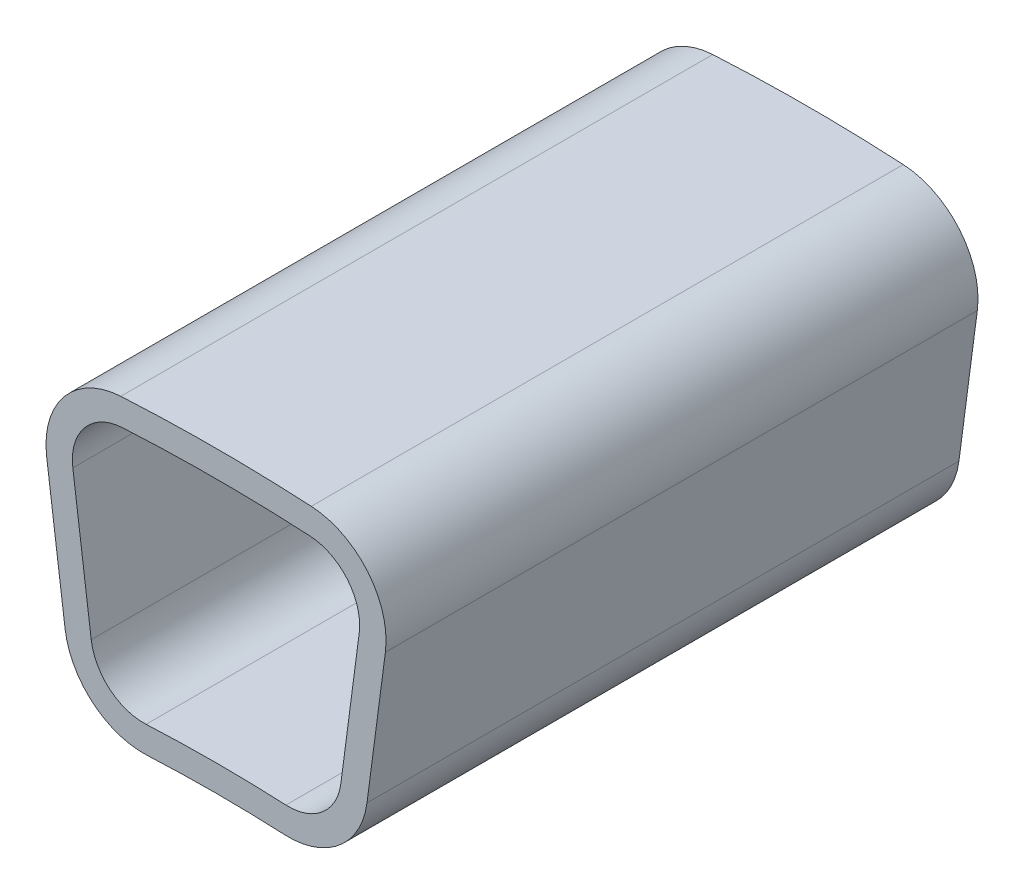
ISO-10303-21;
HEADER;
FILE_DESCRIPTION(('STEP AP214'),'2;1');
FILE_NAME('part.step','',(''),(''),'','','');
FILE_SCHEMA(('AUTOMOTIVE_DESIGN { 1 0 10303 214 1 1 1 1 }'));
ENDSEC;
DATA;
#1=APPLICATION_CONTEXT('core data for automotive mechanical design processes');
#2=APPLICATION_PROTOCOL_DEFINITION('international standard','automotive_design',2000,#1);
#3=PRODUCT_CONTEXT('',#1,'mechanical');
#4=PRODUCT('Part','Part','',(#3));
#5=PRODUCT_RELATED_PRODUCT_CATEGORY('part','',(#4));
#6=PRODUCT_DEFINITION_FORMATION('','',#4);
#7=PRODUCT_DEFINITION_CONTEXT('part definition',#1,'design');
#8=PRODUCT_DEFINITION('design','',#6,#7);
#9=PRODUCT_DEFINITION_SHAPE('','',#8);
#10=(LENGTH_UNIT() NAMED_UNIT(*) SI_UNIT(.MILLI.,.METRE.));
#11=(NAMED_UNIT(*) PLANE_ANGLE_UNIT() SI_UNIT($,.RADIAN.));
#12=(NAMED_UNIT(*) SI_UNIT($,.STERADIAN.) SOLID_ANGLE_UNIT());
#13=UNCERTAINTY_MEASURE_WITH_UNIT(LENGTH_MEASURE(1.E-05),#10,'distance_accuracy_value','');
#14=(GEOMETRIC_REPRESENTATION_CONTEXT(3) GLOBAL_UNCERTAINTY_ASSIGNED_CONTEXT((#13)) GLOBAL_UNIT_ASSIGNED_CONTEXT((#10,
#11,#12)) REPRESENTATION_CONTEXT('',''));
#15=CARTESIAN_POINT('',(0.,0.,0.));
#16=DIRECTION('',(0.,0.,1.));
#17=DIRECTION('',(1.,0.,0.));
#18=AXIS2_PLACEMENT_3D('',#15,#16,#17);
#19=CARTESIAN_POINT('',(0.,0.,59.4458118903769));
#20=DIRECTION('',(0.,0.,-1.));
#21=DIRECTION('',(-1.,0.,0.));
#22=AXIS2_PLACEMENT_3D('',#19,#20,#21);
#23=CYLINDRICAL_SURFACE('',#22,80.5256144787589);
#24=CARTESIAN_POINT('',(0.,0.,33.65));
#25=DIRECTION('',(0.,0.,1.));
#26=DIRECTION('',(1.,0.,0.));
#27=AXIS2_PLACEMENT_3D('',#24,#25,#26);
#28=CIRCLE('',#27,80.5256144787589);
#29=CARTESIAN_POINT('',(-3.90221400091127,80.4310096484733,33.65));
#30=VERTEX_POINT('',#29);
#31=CARTESIAN_POINT('',(3.90221400091125,80.4310096484733,33.65));
#32=VERTEX_POINT('',#31);
#33=EDGE_CURVE('E314',#30,#32,#28,.F.);
#34=ORIENTED_EDGE('',*,*,#33,.F.);
#35=DIRECTION('',(0.,0.,-1.));
#36=VECTOR('',#35,1.);
#37=CARTESIAN_POINT('',(-3.90221400091127,80.4310096484733,59.4458118903769));
#38=LINE('',#37,#36);
#39=CARTESIAN_POINT('',(-3.90221400091127,80.4310096484733,0.));
#40=VERTEX_POINT('',#39);
#41=EDGE_CURVE('E58',#30,#40,#38,.T.);
#42=ORIENTED_EDGE('',*,*,#41,.T.);
#43=CARTESIAN_POINT('',(0.,0.,0.));
#44=DIRECTION('',(0.,0.,-1.));
#45=DIRECTION('',(1.,0.,0.));
#46=AXIS2_PLACEMENT_3D('',#43,#44,#45);
#47=CIRCLE('',#46,80.5256144787589);
#48=CARTESIAN_POINT('',(3.90221400091125,80.4310096484733,0.));
#49=VERTEX_POINT('',#48);
#50=EDGE_CURVE('E209',#40,#49,#47,.T.);
#51=ORIENTED_EDGE('',*,*,#50,.T.);
#52=DIRECTION('',(0.,0.,-1.));
#53=VECTOR('',#52,1.);
#54=CARTESIAN_POINT('',(3.90221400091125,80.4310096484733,59.4458118903769));
#55=LINE('',#54,#53);
#56=EDGE_CURVE('E212',#32,#49,#55,.T.);
#57=ORIENTED_EDGE('',*,*,#56,.F.);
#58=EDGE_LOOP('',(#34,#42,#51,#57));
#59=FACE_BOUND('',#58,.T.);
#60=ADVANCED_FACE('F43',(#59),#23,.F.);
#61=CARTESIAN_POINT('',(-4.12028080012497,84.9257228619143,59.4458118903769));
#62=DIRECTION('',(0.,0.,-1.));
#63=DIRECTION('',(-1.,0.,0.));
#64=AXIS2_PLACEMENT_3D('',#61,#62,#63);
#65=CYLINDRICAL_SURFACE('',#64,4.5);
#66=CARTESIAN_POINT('',(-4.12028080012497,84.9257228619143,33.65));
#67=DIRECTION('',(0.,0.,1.));
#68=DIRECTION('',(1.,0.,0.));
#69=AXIS2_PLACEMENT_3D('',#66,#67,#68);
#70=CIRCLE('',#69,4.5);
#71=CARTESIAN_POINT('',(-8.58178267630712,84.338354996924,33.65));
#72=VERTEX_POINT('',#71);
#73=EDGE_CURVE('E250',#72,#30,#70,.T.);
#74=ORIENTED_EDGE('',*,*,#73,.F.);
#75=DIRECTION('',(0.,0.,-1.));
#76=VECTOR('',#75,1.);
#77=CARTESIAN_POINT('',(-8.58178267630712,84.338354996924,59.4458118903769));
#78=LINE('',#77,#76);
#79=CARTESIAN_POINT('',(-8.58178267630712,84.338354996924,0.));
#80=VERTEX_POINT('',#79);
#81=EDGE_CURVE('E215',#72,#80,#78,.T.);
#82=ORIENTED_EDGE('',*,*,#81,.T.);
#83=CARTESIAN_POINT('',(-4.12028080012497,84.9257228619143,0.));
#84=DIRECTION('',(0.,0.,1.));
#85=DIRECTION('',(1.,0.,0.));
#86=AXIS2_PLACEMENT_3D('',#83,#84,#85);
#87=CIRCLE('',#86,4.5);
#88=EDGE_CURVE('E207',#80,#40,#87,.T.);
#89=ORIENTED_EDGE('',*,*,#88,.T.);
#90=ORIENTED_EDGE('',*,*,#41,.F.);
#91=EDGE_LOOP('',(#74,#82,#89,#90));
#92=FACE_BOUND('',#91,.T.);
#93=ADVANCED_FACE('F247',(#92),#65,.T.);
#94=CARTESIAN_POINT('',(-9.62675062646801,92.2756746020247,59.4458118903769));
#95=DIRECTION('',(0.99144486137381,0.13052619222005,0.));
#96=DIRECTION('',(-0.13052619222005,0.991444861373811,0.));
#97=AXIS2_PLACEMENT_3D('',#94,#95,#96);
#98=PLANE('',#97);
#99=DIRECTION('',(0.13052619222005,-0.991444861373811,0.));
#100=VECTOR('',#99,1.);
#101=CARTESIAN_POINT('',(-9.62675062646801,92.2756746020247,33.65));
#102=LINE('',#101,#100);
#103=CARTESIAN_POINT('',(-9.62675062646801,92.2756746020247,33.65));
#104=VERTEX_POINT('',#103);
#105=EDGE_CURVE('E255',#104,#72,#102,.T.);
#106=ORIENTED_EDGE('',*,*,#105,.F.);
#107=DIRECTION('',(0.,0.,-1.));
#108=VECTOR('',#107,1.);
#109=CARTESIAN_POINT('',(-9.62675062646801,92.2756746020247,59.4458118903769));
#110=LINE('',#109,#108);
#111=CARTESIAN_POINT('',(-9.62675062646801,92.2756746020247,0.));
#112=VERTEX_POINT('',#111);
#113=EDGE_CURVE('E217',#104,#112,#110,.T.);
#114=ORIENTED_EDGE('',*,*,#113,.T.);
#115=DIRECTION('',(0.13052619222005,-0.991444861373811,0.));
#116=VECTOR('',#115,1.);
#117=CARTESIAN_POINT('',(-9.62675062646801,92.2756746020247,0.));
#118=LINE('',#117,#116);
#119=EDGE_CURVE('E204',#112,#80,#118,.T.);
#120=ORIENTED_EDGE('',*,*,#119,.T.);
#121=ORIENTED_EDGE('',*,*,#81,.F.);
#122=EDGE_LOOP('',(#106,#114,#120,#121));
#123=FACE_BOUND('',#122,.T.);
#124=ADVANCED_FACE('F253',(#123),#98,.F.);
#125=CARTESIAN_POINT('',(-5.16524875028588,92.8630424670149,59.4458118903769));
#126=DIRECTION('',(0.,0.,-1.));
#127=DIRECTION('',(-1.,0.,0.));
#128=AXIS2_PLACEMENT_3D('',#125,#126,#127);
#129=CYLINDRICAL_SURFACE('',#128,4.49999999999999);
#130=CARTESIAN_POINT('',(-5.16524875028588,92.8630424670149,33.65));
#131=DIRECTION('',(0.,0.,1.));
#132=DIRECTION('',(1.,0.,0.));
#133=AXIS2_PLACEMENT_3D('',#130,#131,#132);
#134=CIRCLE('',#133,4.49999999999999);
#135=CARTESIAN_POINT('',(-5.41516245174076,97.3560974568659,33.65));
#136=VERTEX_POINT('',#135);
#137=EDGE_CURVE('E318',#136,#104,#134,.T.);
#138=ORIENTED_EDGE('',*,*,#137,.F.);
#139=DIRECTION('',(0.,0.,-1.));
#140=VECTOR('',#139,1.);
#141=CARTESIAN_POINT('',(-5.41516245174076,97.3560974568659,59.4458118903769));
#142=LINE('',#141,#140);
#143=CARTESIAN_POINT('',(-5.41516245174076,97.3560974568659,0.));
#144=VERTEX_POINT('',#143);
#145=EDGE_CURVE('E219',#136,#144,#142,.T.);
#146=ORIENTED_EDGE('',*,*,#145,.T.);
#147=CARTESIAN_POINT('',(-5.16524875028588,92.8630424670149,0.));
#148=DIRECTION('',(0.,0.,1.));
#149=DIRECTION('',(1.,0.,0.));
#150=AXIS2_PLACEMENT_3D('',#147,#148,#149);
#151=CIRCLE('',#150,4.49999999999999);
#152=EDGE_CURVE('E201',#144,#112,#151,.T.);
#153=ORIENTED_EDGE('',*,*,#152,.T.);
#154=ORIENTED_EDGE('',*,*,#113,.F.);
#155=EDGE_LOOP('',(#138,#146,#153,#154));
#156=FACE_BOUND('',#155,.T.);
#157=ADVANCED_FACE('F258',(#156),#129,.T.);
#158=CARTESIAN_POINT('',(0.,0.,59.4458118903769));
#159=DIRECTION('',(0.,0.,-1.));
#160=DIRECTION('',(-1.,0.,0.));
#161=AXIS2_PLACEMENT_3D('',#158,#159,#160);
#162=CYLINDRICAL_SURFACE('',#161,97.5065828362861);
#163=CARTESIAN_POINT('',(0.,0.,33.65));
#164=DIRECTION('',(0.,0.,1.));
#165=DIRECTION('',(1.,0.,0.));
#166=AXIS2_PLACEMENT_3D('',#163,#164,#165);
#167=CIRCLE('',#166,97.5065828362861);
#168=CARTESIAN_POINT('',(5.41516245174078,97.3560974568659,33.65));
#169=VERTEX_POINT('',#168);
#170=EDGE_CURVE('E264',#169,#136,#167,.T.);
#171=ORIENTED_EDGE('',*,*,#170,.F.);
#172=DIRECTION('',(0.,0.,-1.));
#173=VECTOR('',#172,1.);
#174=CARTESIAN_POINT('',(5.41516245174078,97.3560974568659,59.4458118903769));
#175=LINE('',#174,#173);
#176=CARTESIAN_POINT('',(5.41516245174078,97.3560974568659,0.));
#177=VERTEX_POINT('',#176);
#178=EDGE_CURVE('E221',#169,#177,#175,.T.);
#179=ORIENTED_EDGE('',*,*,#178,.T.);
#180=CARTESIAN_POINT('',(0.,0.,0.));
#181=DIRECTION('',(0.,0.,1.));
#182=DIRECTION('',(1.,0.,0.));
#183=AXIS2_PLACEMENT_3D('',#180,#181,#182);
#184=CIRCLE('',#183,97.5065828362861);
#185=EDGE_CURVE('E198',#177,#144,#184,.T.);
#186=ORIENTED_EDGE('',*,*,#185,.T.);
#187=ORIENTED_EDGE('',*,*,#145,.F.);
#188=EDGE_LOOP('',(#171,#179,#186,#187));
#189=FACE_BOUND('',#188,.T.);
#190=ADVANCED_FACE('F261',(#189),#162,.T.);
#191=CARTESIAN_POINT('',(5.16524875028588,92.8630424670149,59.4458118903769));
#192=DIRECTION('',(0.,0.,-1.));
#193=DIRECTION('',(-1.,0.,0.));
#194=AXIS2_PLACEMENT_3D('',#191,#192,#193);
#195=CYLINDRICAL_SURFACE('',#194,4.50000000000001);
#196=CARTESIAN_POINT('',(5.16524875028588,92.8630424670149,33.65));
#197=DIRECTION('',(0.,0.,1.));
#198=DIRECTION('',(1.,0.,0.));
#199=AXIS2_PLACEMENT_3D('',#196,#197,#198);
#200=CIRCLE('',#199,4.50000000000001);
#201=CARTESIAN_POINT('',(9.62675062646804,92.2756746020247,33.65));
#202=VERTEX_POINT('',#201);
#203=EDGE_CURVE('E268',#202,#169,#200,.T.);
#204=ORIENTED_EDGE('',*,*,#203,.F.);
#205=DIRECTION('',(0.,0.,-1.));
#206=VECTOR('',#205,1.);
#207=CARTESIAN_POINT('',(9.62675062646804,92.2756746020247,59.4458118903769));
#208=LINE('',#207,#206);
#209=CARTESIAN_POINT('',(9.62675062646804,92.2756746020247,0.));
#210=VERTEX_POINT('',#209);
#211=EDGE_CURVE('E223',#202,#210,#208,.T.);
#212=ORIENTED_EDGE('',*,*,#211,.T.);
#213=CARTESIAN_POINT('',(5.16524875028588,92.8630424670149,0.));
#214=DIRECTION('',(0.,0.,1.));
#215=DIRECTION('',(1.,0.,0.));
#216=AXIS2_PLACEMENT_3D('',#213,#214,#215);
#217=CIRCLE('',#216,4.50000000000001);
#218=EDGE_CURVE('E195',#210,#177,#217,.T.);
#219=ORIENTED_EDGE('',*,*,#218,.T.);
#220=ORIENTED_EDGE('',*,*,#178,.F.);
#221=EDGE_LOOP('',(#204,#212,#219,#220));
#222=FACE_BOUND('',#221,.T.);
#223=ADVANCED_FACE('F267',(#222),#195,.T.);
#224=CARTESIAN_POINT('',(8.5817826763071,84.338354996924,59.4458118903769));
#225=DIRECTION('',(-0.99144486137381,0.130526192220055,0.));
#226=DIRECTION('',(-0.130526192220055,-0.99144486137381,0.));
#227=AXIS2_PLACEMENT_3D('',#224,#225,#226);
#228=PLANE('',#227);
#229=DIRECTION('',(0.130526192220055,0.99144486137381,0.));
#230=VECTOR('',#229,1.);
#231=CARTESIAN_POINT('',(8.5817826763071,84.338354996924,33.65));
#232=LINE('',#231,#230);
#233=CARTESIAN_POINT('',(8.5817826763071,84.338354996924,33.65));
#234=VERTEX_POINT('',#233);
#235=EDGE_CURVE('E231',#234,#202,#232,.T.);
#236=ORIENTED_EDGE('',*,*,#235,.F.);
#237=DIRECTION('',(0.,0.,-1.));
#238=VECTOR('',#237,1.);
#239=CARTESIAN_POINT('',(8.5817826763071,84.338354996924,59.4458118903769));
#240=LINE('',#239,#238);
#241=CARTESIAN_POINT('',(8.5817826763071,84.338354996924,0.));
#242=VERTEX_POINT('',#241);
#243=EDGE_CURVE('E51',#234,#242,#240,.T.);
#244=ORIENTED_EDGE('',*,*,#243,.T.);
#245=DIRECTION('',(0.130526192220055,0.99144486137381,0.));
#246=VECTOR('',#245,1.);
#247=CARTESIAN_POINT('',(8.5817826763071,84.338354996924,0.));
#248=LINE('',#247,#246);
#249=EDGE_CURVE('E192',#242,#210,#248,.T.);
#250=ORIENTED_EDGE('',*,*,#249,.T.);
#251=ORIENTED_EDGE('',*,*,#211,.F.);
#252=EDGE_LOOP('',(#236,#244,#250,#251));
#253=FACE_BOUND('',#252,.T.);
#254=ADVANCED_FACE('F227',(#253),#228,.F.);
#255=CARTESIAN_POINT('',(4.12028080012497,84.9257228619142,59.4458118903769));
#256=DIRECTION('',(0.,0.,-1.));
#257=DIRECTION('',(-1.,0.,0.));
#258=AXIS2_PLACEMENT_3D('',#255,#256,#257);
#259=CYLINDRICAL_SURFACE('',#258,4.49999999999998);
#260=CARTESIAN_POINT('',(4.12028080012497,84.9257228619142,33.65));
#261=DIRECTION('',(0.,0.,1.));
#262=DIRECTION('',(1.,0.,0.));
#263=AXIS2_PLACEMENT_3D('',#260,#261,#262);
#264=CIRCLE('',#263,4.49999999999998);
#265=EDGE_CURVE('E241',#32,#234,#264,.T.);
#266=ORIENTED_EDGE('',*,*,#265,.F.);
#267=ORIENTED_EDGE('',*,*,#56,.T.);
#268=CARTESIAN_POINT('',(4.12028080012497,84.9257228619142,0.));
#269=DIRECTION('',(0.,0.,1.));
#270=DIRECTION('',(1.,0.,0.));
#271=AXIS2_PLACEMENT_3D('',#268,#269,#270);
#272=CIRCLE('',#271,4.49999999999998);
#273=EDGE_CURVE('E189',#49,#242,#272,.T.);
#274=ORIENTED_EDGE('',*,*,#273,.T.);
#275=ORIENTED_EDGE('',*,*,#243,.F.);
#276=EDGE_LOOP('',(#266,#267,#274,#275));
#277=FACE_BOUND('',#276,.T.);
#278=ADVANCED_FACE('F45',(#277),#259,.T.);
#279=CARTESIAN_POINT('',(4.12028080012497,84.9257228619142,0.));
#280=DIRECTION('',(0.,0.,1.));
#281=DIRECTION('',(1.,0.,0.));
#282=AXIS2_PLACEMENT_3D('',#279,#280,#281);
#283=PLANE('',#282);
#284=ORIENTED_EDGE('',*,*,#273,.F.);
#285=ORIENTED_EDGE('',*,*,#50,.F.);
#286=ORIENTED_EDGE('',*,*,#88,.F.);
#287=ORIENTED_EDGE('',*,*,#119,.F.);
#288=ORIENTED_EDGE('',*,*,#152,.F.);
#289=ORIENTED_EDGE('',*,*,#185,.F.);
#290=ORIENTED_EDGE('',*,*,#218,.F.);
#291=ORIENTED_EDGE('',*,*,#249,.F.);
#292=EDGE_LOOP('',(#284,#285,#286,#287,#288,#289,#290,#291));
#293=FACE_BOUND('',#292,.T.);
#294=CARTESIAN_POINT('',(5.16524875028588,92.8630424670149,0.));
#295=DIRECTION('',(0.,0.,1.));
#296=DIRECTION('',(1.,0.,0.));
#297=AXIS2_PLACEMENT_3D('',#294,#295,#296);
#298=CIRCLE('',#297,3.00000000000001);
#299=CARTESIAN_POINT('',(8.13958333440732,92.4714638903548,0.));
#300=VERTEX_POINT('',#299);
#301=CARTESIAN_POINT('',(5.33185788458914,95.8584124602489,0.));
#302=VERTEX_POINT('',#301);
#303=EDGE_CURVE('E270',#300,#302,#298,.T.);
#304=ORIENTED_EDGE('',*,*,#303,.T.);
#305=CARTESIAN_POINT('',(0.,0.,0.));
#306=DIRECTION('',(0.,0.,1.));
#307=DIRECTION('',(1.,0.,0.));
#308=AXIS2_PLACEMENT_3D('',#305,#306,#307);
#309=CIRCLE('',#308,96.0065828362861);
#310=CARTESIAN_POINT('',(-5.33185788458913,95.8584124602489,0.));
#311=VERTEX_POINT('',#310);
#312=EDGE_CURVE('E277',#302,#311,#309,.T.);
#313=ORIENTED_EDGE('',*,*,#312,.T.);
#314=CARTESIAN_POINT('',(-5.16524875028588,92.8630424670149,0.));
#315=DIRECTION('',(0.,0.,1.));
#316=DIRECTION('',(1.,0.,0.));
#317=AXIS2_PLACEMENT_3D('',#314,#315,#316);
#318=CIRCLE('',#317,2.99999999999998);
#319=CARTESIAN_POINT('',(-8.1395833344073,92.4714638903548,0.));
#320=VERTEX_POINT('',#319);
#321=EDGE_CURVE('E280',#311,#320,#318,.T.);
#322=ORIENTED_EDGE('',*,*,#321,.T.);
#323=DIRECTION('',(0.13052619222005,-0.991444861373811,0.));
#324=VECTOR('',#323,1.);
#325=CARTESIAN_POINT('',(-8.1395833344073,92.4714638903548,0.));
#326=LINE('',#325,#324);
#327=CARTESIAN_POINT('',(-7.0946153842464,84.5341442852541,0.));
#328=VERTEX_POINT('',#327);
#329=EDGE_CURVE('E283',#320,#328,#326,.T.);
#330=ORIENTED_EDGE('',*,*,#329,.T.);
#331=CARTESIAN_POINT('',(-4.12028080012497,84.9257228619143,0.));
#332=DIRECTION('',(0.,0.,1.));
#333=DIRECTION('',(1.,0.,0.));
#334=AXIS2_PLACEMENT_3D('',#331,#332,#333);
#335=CIRCLE('',#334,3.);
#336=CARTESIAN_POINT('',(-3.9749029339825,81.929247386287,0.));
#337=VERTEX_POINT('',#336);
#338=EDGE_CURVE('E286',#328,#337,#335,.T.);
#339=ORIENTED_EDGE('',*,*,#338,.T.);
#340=CARTESIAN_POINT('',(0.,0.,0.));
#341=DIRECTION('',(0.,0.,-1.));
#342=DIRECTION('',(1.,0.,0.));
#343=AXIS2_PLACEMENT_3D('',#340,#341,#342);
#344=CIRCLE('',#343,82.025614478759);
#345=CARTESIAN_POINT('',(3.97490293398249,81.929247386287,0.));
#346=VERTEX_POINT('',#345);
#347=EDGE_CURVE('E289',#337,#346,#344,.T.);
#348=ORIENTED_EDGE('',*,*,#347,.T.);
#349=CARTESIAN_POINT('',(4.12028080012497,84.9257228619142,0.));
#350=DIRECTION('',(0.,0.,1.));
#351=DIRECTION('',(1.,0.,0.));
#352=AXIS2_PLACEMENT_3D('',#349,#350,#351);
#353=CIRCLE('',#352,2.99999999999998);
#354=CARTESIAN_POINT('',(7.09461538424639,84.5341442852541,0.));
#355=VERTEX_POINT('',#354);
#356=EDGE_CURVE('E292',#346,#355,#353,.T.);
#357=ORIENTED_EDGE('',*,*,#356,.T.);
#358=DIRECTION('',(0.130526192220055,0.99144486137381,0.));
#359=VECTOR('',#358,1.);
#360=CARTESIAN_POINT('',(7.09461538424639,84.5341442852541,0.));
#361=LINE('',#360,#359);
#362=EDGE_CURVE('E171',#355,#300,#361,.T.);
#363=ORIENTED_EDGE('',*,*,#362,.T.);
#364=EDGE_LOOP('',(#304,#313,#322,#330,#339,#348,#357,#363));
#365=FACE_BOUND('',#364,.T.);
#366=ADVANCED_FACE('F237',(#293,#365),#283,.F.);
#367=CARTESIAN_POINT('',(7.09461538424639,84.5341442852541,59.4458118903769));
#368=DIRECTION('',(-0.99144486137381,0.130526192220055,0.));
#369=DIRECTION('',(-0.130526192220055,-0.99144486137381,0.));
#370=AXIS2_PLACEMENT_3D('',#367,#368,#369);
#371=PLANE('',#370);
#372=DIRECTION('',(0.,0.,-1.));
#373=VECTOR('',#372,1.);
#374=CARTESIAN_POINT('',(7.09461538424639,84.5341442852541,59.4458118903769));
#375=LINE('',#374,#373);
#376=CARTESIAN_POINT('',(7.09461538424639,84.5341442852541,33.65));
#377=VERTEX_POINT('',#376);
#378=EDGE_CURVE('E163',#377,#355,#375,.T.);
#379=ORIENTED_EDGE('',*,*,#378,.F.);
#380=DIRECTION('',(0.130526192220055,0.99144486137381,0.));
#381=VECTOR('',#380,1.);
#382=CARTESIAN_POINT('',(7.09461538424639,84.5341442852541,33.65));
#383=LINE('',#382,#381);
#384=CARTESIAN_POINT('',(8.13958333440732,92.4714638903548,33.65));
#385=VERTEX_POINT('',#384);
#386=EDGE_CURVE('E11',#377,#385,#383,.T.);
#387=ORIENTED_EDGE('',*,*,#386,.T.);
#388=DIRECTION('',(0.,0.,-1.));
#389=VECTOR('',#388,1.);
#390=CARTESIAN_POINT('',(8.13958333440732,92.4714638903548,59.4458118903769));
#391=LINE('',#390,#389);
#392=EDGE_CURVE('E173',#385,#300,#391,.T.);
#393=ORIENTED_EDGE('',*,*,#392,.T.);
#394=ORIENTED_EDGE('',*,*,#362,.F.);
#395=EDGE_LOOP('',(#379,#387,#393,#394));
#396=FACE_BOUND('',#395,.T.);
#397=ADVANCED_FACE('F169',(#396),#371,.T.);
#398=CARTESIAN_POINT('',(4.12028080012497,84.9257228619142,59.4458118903769));
#399=DIRECTION('',(0.,0.,-1.));
#400=DIRECTION('',(-1.,0.,0.));
#401=AXIS2_PLACEMENT_3D('',#398,#399,#400);
#402=CYLINDRICAL_SURFACE('',#401,2.99999999999998);
#403=DIRECTION('',(0.,0.,-1.));
#404=VECTOR('',#403,1.);
#405=CARTESIAN_POINT('',(3.97490293398249,81.929247386287,59.4458118903769));
#406=LINE('',#405,#404);
#407=CARTESIAN_POINT('',(3.97490293398249,81.929247386287,33.65));
#408=VERTEX_POINT('',#407);
#409=EDGE_CURVE('E165',#408,#346,#406,.T.);
#410=ORIENTED_EDGE('',*,*,#409,.F.);
#411=CARTESIAN_POINT('',(4.12028080012497,84.9257228619142,33.65));
#412=DIRECTION('',(0.,0.,1.));
#413=DIRECTION('',(1.,0.,0.));
#414=AXIS2_PLACEMENT_3D('',#411,#412,#413);
#415=CIRCLE('',#414,2.99999999999998);
#416=EDGE_CURVE('E156',#408,#377,#415,.T.);
#417=ORIENTED_EDGE('',*,*,#416,.T.);
#418=ORIENTED_EDGE('',*,*,#378,.T.);
#419=ORIENTED_EDGE('',*,*,#356,.F.);
#420=EDGE_LOOP('',(#410,#417,#418,#419));
#421=FACE_BOUND('',#420,.T.);
#422=ADVANCED_FACE('F161',(#421),#402,.F.);
#423=CARTESIAN_POINT('',(0.,0.,59.4458118903769));
#424=DIRECTION('',(0.,0.,-1.));
#425=DIRECTION('',(-1.,0.,0.));
#426=AXIS2_PLACEMENT_3D('',#423,#424,#425);
#427=CYLINDRICAL_SURFACE('',#426,82.025614478759);
#428=DIRECTION('',(0.,0.,-1.));
#429=VECTOR('',#428,1.);
#430=CARTESIAN_POINT('',(-3.9749029339825,81.929247386287,59.4458118903769));
#431=LINE('',#430,#429);
#432=CARTESIAN_POINT('',(-3.9749029339825,81.929247386287,33.65));
#433=VERTEX_POINT('',#432);
#434=EDGE_CURVE('E175',#433,#337,#431,.T.);
#435=ORIENTED_EDGE('',*,*,#434,.F.);
#436=CARTESIAN_POINT('',(0.,0.,33.65));
#437=DIRECTION('',(0.,0.,1.));
#438=DIRECTION('',(1.,0.,0.));
#439=AXIS2_PLACEMENT_3D('',#436,#437,#438);
#440=CIRCLE('',#439,82.025614478759);
#441=EDGE_CURVE('E167',#433,#408,#440,.F.);
#442=ORIENTED_EDGE('',*,*,#441,.T.);
#443=ORIENTED_EDGE('',*,*,#409,.T.);
#444=ORIENTED_EDGE('',*,*,#347,.F.);
#445=EDGE_LOOP('',(#435,#442,#443,#444));
#446=FACE_BOUND('',#445,.T.);
#447=ADVANCED_FACE('F298',(#446),#427,.T.);
#448=CARTESIAN_POINT('',(-4.12028080012497,84.9257228619143,59.4458118903769));
#449=DIRECTION('',(0.,0.,-1.));
#450=DIRECTION('',(-1.,0.,0.));
#451=AXIS2_PLACEMENT_3D('',#448,#449,#450);
#452=CYLINDRICAL_SURFACE('',#451,3.);
#453=DIRECTION('',(0.,0.,-1.));
#454=VECTOR('',#453,1.);
#455=CARTESIAN_POINT('',(-7.0946153842464,84.5341442852541,59.4458118903769));
#456=LINE('',#455,#454);
#457=CARTESIAN_POINT('',(-7.0946153842464,84.5341442852541,33.65));
#458=VERTEX_POINT('',#457);
#459=EDGE_CURVE('E181',#458,#328,#456,.T.);
#460=ORIENTED_EDGE('',*,*,#459,.F.);
#461=CARTESIAN_POINT('',(-4.12028080012497,84.9257228619143,33.65));
#462=DIRECTION('',(0.,0.,1.));
#463=DIRECTION('',(1.,0.,0.));
#464=AXIS2_PLACEMENT_3D('',#461,#462,#463);
#465=CIRCLE('',#464,3.);
#466=EDGE_CURVE('E300',#458,#433,#465,.T.);
#467=ORIENTED_EDGE('',*,*,#466,.T.);
#468=ORIENTED_EDGE('',*,*,#434,.T.);
#469=ORIENTED_EDGE('',*,*,#338,.F.);
#470=EDGE_LOOP('',(#460,#467,#468,#469));
#471=FACE_BOUND('',#470,.T.);
#472=ADVANCED_FACE('F335',(#471),#452,.F.);
#473=CARTESIAN_POINT('',(-8.1395833344073,92.4714638903548,59.4458118903769));
#474=DIRECTION('',(0.991444861373811,0.13052619222005,0.));
#475=DIRECTION('',(-0.13052619222005,0.991444861373811,0.));
#476=AXIS2_PLACEMENT_3D('',#473,#474,#475);
#477=PLANE('',#476);
#478=DIRECTION('',(0.,0.,-1.));
#479=VECTOR('',#478,1.);
#480=CARTESIAN_POINT('',(-8.1395833344073,92.4714638903548,59.4458118903769));
#481=LINE('',#480,#479);
#482=CARTESIAN_POINT('',(-8.1395833344073,92.4714638903548,33.65));
#483=VERTEX_POINT('',#482);
#484=EDGE_CURVE('E183',#483,#320,#481,.T.);
#485=ORIENTED_EDGE('',*,*,#484,.F.);
#486=DIRECTION('',(0.13052619222005,-0.991444861373811,0.));
#487=VECTOR('',#486,1.);
#488=CARTESIAN_POINT('',(-8.1395833344073,92.4714638903548,33.65));
#489=LINE('',#488,#487);
#490=EDGE_CURVE('E302',#483,#458,#489,.T.);
#491=ORIENTED_EDGE('',*,*,#490,.T.);
#492=ORIENTED_EDGE('',*,*,#459,.T.);
#493=ORIENTED_EDGE('',*,*,#329,.F.);
#494=EDGE_LOOP('',(#485,#491,#492,#493));
#495=FACE_BOUND('',#494,.T.);
#496=ADVANCED_FACE('F332',(#495),#477,.T.);
#497=CARTESIAN_POINT('',(-5.16524875028588,92.8630424670149,59.4458118903769));
#498=DIRECTION('',(0.,0.,-1.));
#499=DIRECTION('',(-1.,0.,0.));
#500=AXIS2_PLACEMENT_3D('',#497,#498,#499);
#501=CYLINDRICAL_SURFACE('',#500,2.99999999999998);
#502=DIRECTION('',(0.,0.,-1.));
#503=VECTOR('',#502,1.);
#504=CARTESIAN_POINT('',(-5.33185788458913,95.8584124602489,59.4458118903769));
#505=LINE('',#504,#503);
#506=CARTESIAN_POINT('',(-5.33185788458913,95.8584124602489,33.65));
#507=VERTEX_POINT('',#506);
#508=EDGE_CURVE('E185',#507,#311,#505,.T.);
#509=ORIENTED_EDGE('',*,*,#508,.F.);
#510=CARTESIAN_POINT('',(-5.16524875028588,92.8630424670149,33.65));
#511=DIRECTION('',(0.,0.,1.));
#512=DIRECTION('',(1.,0.,0.));
#513=AXIS2_PLACEMENT_3D('',#510,#511,#512);
#514=CIRCLE('',#513,2.99999999999998);
#515=EDGE_CURVE('E307',#507,#483,#514,.T.);
#516=ORIENTED_EDGE('',*,*,#515,.T.);
#517=ORIENTED_EDGE('',*,*,#484,.T.);
#518=ORIENTED_EDGE('',*,*,#321,.F.);
#519=EDGE_LOOP('',(#509,#516,#517,#518));
#520=FACE_BOUND('',#519,.T.);
#521=ADVANCED_FACE('F329',(#520),#501,.F.);
#522=CARTESIAN_POINT('',(0.,0.,59.4458118903769));
#523=DIRECTION('',(0.,0.,-1.));
#524=DIRECTION('',(-1.,0.,0.));
#525=AXIS2_PLACEMENT_3D('',#522,#523,#524);
#526=CYLINDRICAL_SURFACE('',#525,96.0065828362861);
#527=DIRECTION('',(0.,0.,-1.));
#528=VECTOR('',#527,1.);
#529=CARTESIAN_POINT('',(5.33185788458914,95.8584124602489,59.4458118903769));
#530=LINE('',#529,#528);
#531=CARTESIAN_POINT('',(5.33185788458914,95.8584124602489,33.65));
#532=VERTEX_POINT('',#531);
#533=EDGE_CURVE('E187',#532,#302,#530,.T.);
#534=ORIENTED_EDGE('',*,*,#533,.F.);
#535=CARTESIAN_POINT('',(0.,0.,33.65));
#536=DIRECTION('',(0.,0.,1.));
#537=DIRECTION('',(1.,0.,0.));
#538=AXIS2_PLACEMENT_3D('',#535,#536,#537);
#539=CIRCLE('',#538,96.0065828362861);
#540=EDGE_CURVE('E310',#532,#507,#539,.T.);
#541=ORIENTED_EDGE('',*,*,#540,.T.);
#542=ORIENTED_EDGE('',*,*,#508,.T.);
#543=ORIENTED_EDGE('',*,*,#312,.F.);
#544=EDGE_LOOP('',(#534,#541,#542,#543));
#545=FACE_BOUND('',#544,.T.);
#546=ADVANCED_FACE('F324',(#545),#526,.F.);
#547=CARTESIAN_POINT('',(5.16524875028588,92.8630424670149,59.4458118903769));
#548=DIRECTION('',(0.,0.,-1.));
#549=DIRECTION('',(-1.,0.,0.));
#550=AXIS2_PLACEMENT_3D('',#547,#548,#549);
#551=CYLINDRICAL_SURFACE('',#550,3.00000000000001);
#552=ORIENTED_EDGE('',*,*,#392,.F.);
#553=CARTESIAN_POINT('',(5.16524875028588,92.8630424670149,33.65));
#554=DIRECTION('',(0.,0.,1.));
#555=DIRECTION('',(1.,0.,0.));
#556=AXIS2_PLACEMENT_3D('',#553,#554,#555);
#557=CIRCLE('',#556,3.00000000000001);
#558=EDGE_CURVE('E66',#385,#532,#557,.T.);
#559=ORIENTED_EDGE('',*,*,#558,.T.);
#560=ORIENTED_EDGE('',*,*,#533,.T.);
#561=ORIENTED_EDGE('',*,*,#303,.F.);
#562=EDGE_LOOP('',(#552,#559,#560,#561));
#563=FACE_BOUND('',#562,.T.);
#564=ADVANCED_FACE('F320',(#563),#551,.F.);
#565=CARTESIAN_POINT('',(5.16524875028588,92.8630424670149,33.65));
#566=DIRECTION('',(0.,0.,1.));
#567=DIRECTION('',(1.,0.,0.));
#568=AXIS2_PLACEMENT_3D('',#565,#566,#567);
#569=PLANE('',#568);
#570=ORIENTED_EDGE('',*,*,#558,.F.);
#571=ORIENTED_EDGE('',*,*,#386,.F.);
#572=ORIENTED_EDGE('',*,*,#416,.F.);
#573=ORIENTED_EDGE('',*,*,#441,.F.);
#574=ORIENTED_EDGE('',*,*,#466,.F.);
#575=ORIENTED_EDGE('',*,*,#490,.F.);
#576=ORIENTED_EDGE('',*,*,#515,.F.);
#577=ORIENTED_EDGE('',*,*,#540,.F.);
#578=EDGE_LOOP('',(#570,#571,#572,#573,#574,#575,#576,#577));
#579=FACE_BOUND('',#578,.T.);
#580=ORIENTED_EDGE('',*,*,#33,.T.);
#581=ORIENTED_EDGE('',*,*,#265,.T.);
#582=ORIENTED_EDGE('',*,*,#235,.T.);
#583=ORIENTED_EDGE('',*,*,#203,.T.);
#584=ORIENTED_EDGE('',*,*,#170,.T.);
#585=ORIENTED_EDGE('',*,*,#137,.T.);
#586=ORIENTED_EDGE('',*,*,#105,.T.);
#587=ORIENTED_EDGE('',*,*,#73,.T.);
#588=EDGE_LOOP('',(#580,#581,#582,#583,#584,#585,#586,#587));
#589=FACE_BOUND('',#588,.T.);
#590=ADVANCED_FACE('F154',(#579,#589),#569,.T.);
#591=CLOSED_SHELL('',(#60,#93,#124,#157,#190,#223,#254,#278,#366,#397,#422,#447,#472,#496,#521,
#546,#564,#590));
#592=MANIFOLD_SOLID_BREP('B2',#591);
#593=ADVANCED_BREP_SHAPE_REPRESENTATION('',(#18,#592),#14);
#594=SHAPE_DEFINITION_REPRESENTATION(#9,#593);
ENDSEC;
END-ISO-10303-21;
